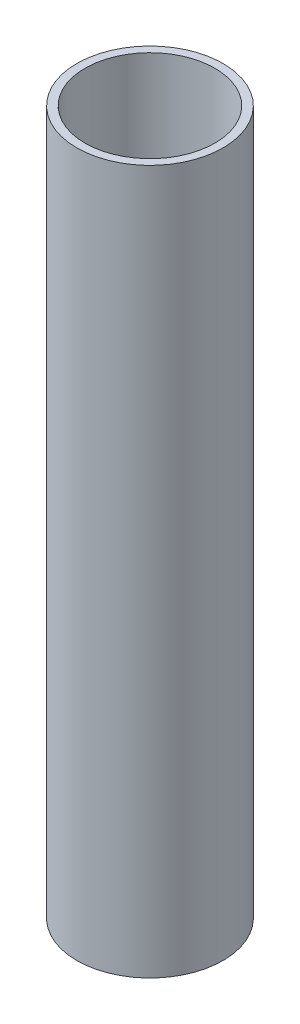
ISO-10303-21;
HEADER;
FILE_DESCRIPTION(('STEP AP214'),'2;1');
FILE_NAME('part.step','',(''),(''),'','','');
FILE_SCHEMA(('AUTOMOTIVE_DESIGN { 1 0 10303 214 1 1 1 1 }'));
ENDSEC;
DATA;
#1=APPLICATION_CONTEXT('core data for automotive mechanical design processes');
#2=APPLICATION_PROTOCOL_DEFINITION('international standard','automotive_design',2000,#1);
#3=PRODUCT_CONTEXT('',#1,'mechanical');
#4=PRODUCT('Part','Part','',(#3));
#5=PRODUCT_RELATED_PRODUCT_CATEGORY('part','',(#4));
#6=PRODUCT_DEFINITION_FORMATION('','',#4);
#7=PRODUCT_DEFINITION_CONTEXT('part definition',#1,'design');
#8=PRODUCT_DEFINITION('design','',#6,#7);
#9=PRODUCT_DEFINITION_SHAPE('','',#8);
#10=(LENGTH_UNIT() NAMED_UNIT(*) SI_UNIT(.MILLI.,.METRE.));
#11=(NAMED_UNIT(*) PLANE_ANGLE_UNIT() SI_UNIT($,.RADIAN.));
#12=(NAMED_UNIT(*) SI_UNIT($,.STERADIAN.) SOLID_ANGLE_UNIT());
#13=UNCERTAINTY_MEASURE_WITH_UNIT(LENGTH_MEASURE(1.E-05),#10,'distance_accuracy_value','');
#14=(GEOMETRIC_REPRESENTATION_CONTEXT(3) GLOBAL_UNCERTAINTY_ASSIGNED_CONTEXT((#13)) GLOBAL_UNIT_ASSIGNED_CONTEXT((#10,
#11,#12)) REPRESENTATION_CONTEXT('',''));
#15=CARTESIAN_POINT('',(0.,0.,0.));
#16=DIRECTION('',(0.,0.,1.));
#17=DIRECTION('',(1.,0.,0.));
#18=AXIS2_PLACEMENT_3D('',#15,#16,#17);
#19=CARTESIAN_POINT('',(13.6326591615901,76.4,-6.07942908557396));
#20=DIRECTION('',(0.,1.,0.));
#21=DIRECTION('',(0.,0.,1.));
#22=AXIS2_PLACEMENT_3D('',#19,#20,#21);
#23=PLANE('',#22);
#24=CARTESIAN_POINT('',(13.6326591615901,76.4,-6.07942908557396));
#25=DIRECTION('',(0.,1.,0.));
#26=DIRECTION('',(0.,0.,1.));
#27=AXIS2_PLACEMENT_3D('',#24,#25,#26);
#28=CIRCLE('',#27,7.9375);
#29=CARTESIAN_POINT('',(13.6326591615901,76.4,1.85807091442604));
#30=VERTEX_POINT('',#29);
#31=EDGE_CURVE('E10',#30,#30,#28,.T.);
#32=ORIENTED_EDGE('',*,*,#31,.T.);
#33=EDGE_LOOP('',(#32));
#34=FACE_BOUND('',#33,.T.);
#35=CARTESIAN_POINT('',(13.6326591615901,76.4,-6.07942908557396));
#36=DIRECTION('',(0.,1.,0.));
#37=DIRECTION('',(0.,0.,1.));
#38=AXIS2_PLACEMENT_3D('',#35,#36,#37);
#39=CIRCLE('',#38,7.0485);
#40=CARTESIAN_POINT('',(13.6326591615901,76.4,0.969070914426036));
#41=VERTEX_POINT('',#40);
#42=EDGE_CURVE('E44',#41,#41,#39,.T.);
#43=ORIENTED_EDGE('',*,*,#42,.F.);
#44=EDGE_LOOP('',(#43));
#45=FACE_BOUND('',#44,.T.);
#46=ADVANCED_FACE('F33',(#34,#45),#23,.T.);
#47=CARTESIAN_POINT('',(13.6326591615901,0.,-6.07942908557396));
#48=DIRECTION('',(0.,1.,0.));
#49=DIRECTION('',(0.,0.,1.));
#50=AXIS2_PLACEMENT_3D('',#47,#48,#49);
#51=PLANE('',#50);
#52=CARTESIAN_POINT('',(13.6326591615901,0.,-6.07942908557396));
#53=DIRECTION('',(0.,1.,0.));
#54=DIRECTION('',(0.,0.,1.));
#55=AXIS2_PLACEMENT_3D('',#52,#53,#54);
#56=CIRCLE('',#55,7.9375);
#57=CARTESIAN_POINT('',(13.6326591615901,0.,1.85807091442604));
#58=VERTEX_POINT('',#57);
#59=EDGE_CURVE('E37',#58,#58,#56,.T.);
#60=ORIENTED_EDGE('',*,*,#59,.F.);
#61=EDGE_LOOP('',(#60));
#62=FACE_BOUND('',#61,.T.);
#63=CARTESIAN_POINT('',(13.6326591615901,0.,-6.07942908557396));
#64=DIRECTION('',(0.,1.,0.));
#65=DIRECTION('',(0.,0.,1.));
#66=AXIS2_PLACEMENT_3D('',#63,#64,#65);
#67=CIRCLE('',#66,7.0485);
#68=CARTESIAN_POINT('',(13.6326591615901,0.,0.969070914426036));
#69=VERTEX_POINT('',#68);
#70=EDGE_CURVE('E46',#69,#69,#67,.T.);
#71=ORIENTED_EDGE('',*,*,#70,.T.);
#72=EDGE_LOOP('',(#71));
#73=FACE_BOUND('',#72,.T.);
#74=ADVANCED_FACE('F56',(#62,#73),#51,.F.);
#75=CARTESIAN_POINT('',(13.6326591615901,76.4,-6.07942908557396));
#76=DIRECTION('',(0.,-1.,0.));
#77=DIRECTION('',(0.,0.,-1.));
#78=AXIS2_PLACEMENT_3D('',#75,#76,#77);
#79=CYLINDRICAL_SURFACE('',#78,7.9375);
#80=ORIENTED_EDGE('',*,*,#31,.F.);
#81=EDGE_LOOP('',(#80));
#82=FACE_BOUND('',#81,.T.);
#83=ORIENTED_EDGE('',*,*,#59,.T.);
#84=EDGE_LOOP('',(#83));
#85=FACE_BOUND('',#84,.T.);
#86=ADVANCED_FACE('F35',(#82,#85),#79,.T.);
#87=CARTESIAN_POINT('',(13.6326591615901,76.4,-6.07942908557396));
#88=DIRECTION('',(0.,-1.,0.));
#89=DIRECTION('',(0.,0.,-1.));
#90=AXIS2_PLACEMENT_3D('',#87,#88,#89);
#91=CYLINDRICAL_SURFACE('',#90,7.0485);
#92=ORIENTED_EDGE('',*,*,#42,.T.);
#93=EDGE_LOOP('',(#92));
#94=FACE_BOUND('',#93,.T.);
#95=ORIENTED_EDGE('',*,*,#70,.F.);
#96=EDGE_LOOP('',(#95));
#97=FACE_BOUND('',#96,.T.);
#98=ADVANCED_FACE('F52',(#94,#97),#91,.F.);
#99=CLOSED_SHELL('',(#46,#74,#86,#98));
#100=MANIFOLD_SOLID_BREP('B2',#99);
#101=ADVANCED_BREP_SHAPE_REPRESENTATION('',(#18,#100),#14);
#102=SHAPE_DEFINITION_REPRESENTATION(#9,#101);
ENDSEC;
END-ISO-10303-21;
